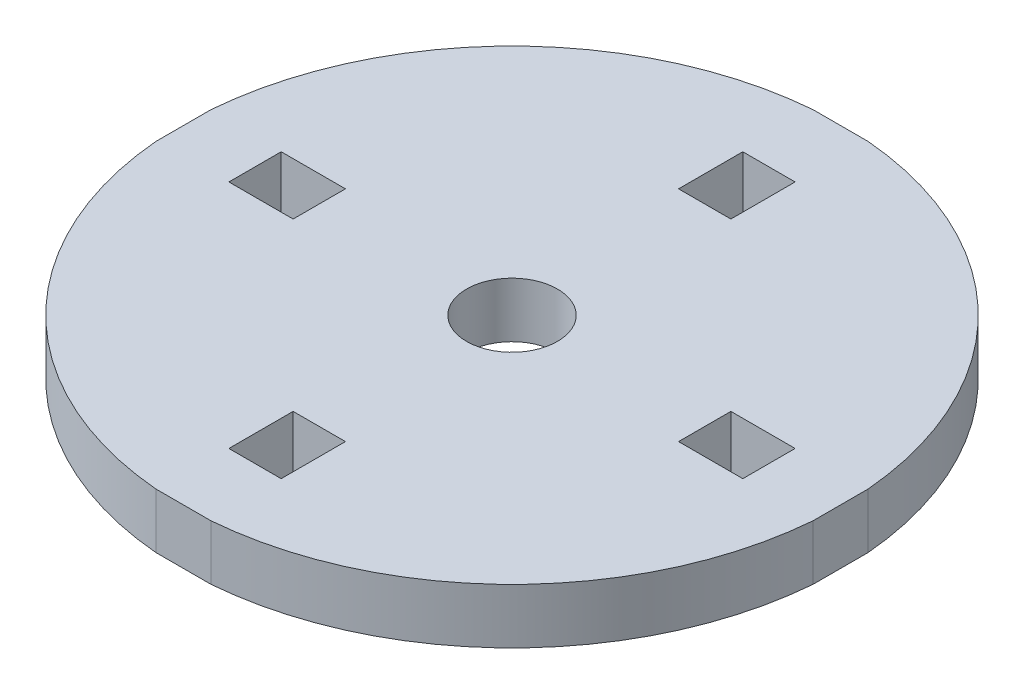
ISO-10303-21;
HEADER;
FILE_DESCRIPTION(('STEP AP214'),'2;1');
FILE_NAME('part.step','',(''),(''),'','','');
FILE_SCHEMA(('AUTOMOTIVE_DESIGN { 1 0 10303 214 1 1 1 1 }'));
ENDSEC;
DATA;
#1=APPLICATION_CONTEXT('core data for automotive mechanical design processes');
#2=APPLICATION_PROTOCOL_DEFINITION('international standard','automotive_design',2000,#1);
#3=PRODUCT_CONTEXT('',#1,'mechanical');
#4=PRODUCT('Part','Part','',(#3));
#5=PRODUCT_RELATED_PRODUCT_CATEGORY('part','',(#4));
#6=PRODUCT_DEFINITION_FORMATION('','',#4);
#7=PRODUCT_DEFINITION_CONTEXT('part definition',#1,'design');
#8=PRODUCT_DEFINITION('design','',#6,#7);
#9=PRODUCT_DEFINITION_SHAPE('','',#8);
#10=(LENGTH_UNIT() NAMED_UNIT(*) SI_UNIT(.MILLI.,.METRE.));
#11=(NAMED_UNIT(*) PLANE_ANGLE_UNIT() SI_UNIT($,.RADIAN.));
#12=(NAMED_UNIT(*) SI_UNIT($,.STERADIAN.) SOLID_ANGLE_UNIT());
#13=UNCERTAINTY_MEASURE_WITH_UNIT(LENGTH_MEASURE(1.E-05),#10,'distance_accuracy_value','');
#14=(GEOMETRIC_REPRESENTATION_CONTEXT(3) GLOBAL_UNCERTAINTY_ASSIGNED_CONTEXT((#13)) GLOBAL_UNIT_ASSIGNED_CONTEXT((#10,
#11,#12)) REPRESENTATION_CONTEXT('',''));
#15=CARTESIAN_POINT('',(0.,0.,0.));
#16=DIRECTION('',(0.,0.,1.));
#17=DIRECTION('',(1.,0.,0.));
#18=AXIS2_PLACEMENT_3D('',#15,#16,#17);
#19=CARTESIAN_POINT('',(0.,3.,0.));
#20=DIRECTION('',(0.,1.,0.));
#21=DIRECTION('',(0.,0.,1.));
#22=AXIS2_PLACEMENT_3D('',#19,#20,#21);
#23=PLANE('',#22);
#24=CARTESIAN_POINT('',(0.,3.,0.));
#25=DIRECTION('',(0.,1.,0.));
#26=DIRECTION('',(0.,0.,1.));
#27=AXIS2_PLACEMENT_3D('',#24,#25,#26);
#28=CIRCLE('',#27,17.9627392120467);
#29=CARTESIAN_POINT('',(-17.9,3.,1.5));
#30=VERTEX_POINT('',#29);
#31=CARTESIAN_POINT('',(-1.5,3.,17.9));
#32=VERTEX_POINT('',#31);
#33=EDGE_CURVE('E329',#30,#32,#28,.T.);
#34=ORIENTED_EDGE('',*,*,#33,.T.);
#35=DIRECTION('',(1.,0.,0.));
#36=VECTOR('',#35,1.);
#37=CARTESIAN_POINT('',(-1.5,3.,17.9));
#38=LINE('',#37,#36);
#39=CARTESIAN_POINT('',(1.5,3.,17.9));
#40=VERTEX_POINT('',#39);
#41=EDGE_CURVE('E332',#32,#40,#38,.T.);
#42=ORIENTED_EDGE('',*,*,#41,.T.);
#43=CARTESIAN_POINT('',(0.,3.,0.));
#44=DIRECTION('',(0.,1.,0.));
#45=DIRECTION('',(0.,0.,-1.));
#46=AXIS2_PLACEMENT_3D('',#43,#44,#45);
#47=CIRCLE('',#46,17.9627392120467);
#48=CARTESIAN_POINT('',(17.9,3.,1.5));
#49=VERTEX_POINT('',#48);
#50=EDGE_CURVE('E335',#40,#49,#47,.T.);
#51=ORIENTED_EDGE('',*,*,#50,.T.);
#52=DIRECTION('',(0.,0.,-1.));
#53=VECTOR('',#52,1.);
#54=CARTESIAN_POINT('',(17.9,3.,1.5));
#55=LINE('',#54,#53);
#56=CARTESIAN_POINT('',(17.9,3.,-1.5));
#57=VERTEX_POINT('',#56);
#58=EDGE_CURVE('E337',#49,#57,#55,.T.);
#59=ORIENTED_EDGE('',*,*,#58,.T.);
#60=CARTESIAN_POINT('',(0.,3.,0.));
#61=DIRECTION('',(0.,1.,0.));
#62=DIRECTION('',(0.,0.,-1.));
#63=AXIS2_PLACEMENT_3D('',#60,#61,#62);
#64=CIRCLE('',#63,17.9627392120467);
#65=CARTESIAN_POINT('',(1.5,3.,-17.9));
#66=VERTEX_POINT('',#65);
#67=EDGE_CURVE('E339',#57,#66,#64,.T.);
#68=ORIENTED_EDGE('',*,*,#67,.T.);
#69=DIRECTION('',(-1.,0.,0.));
#70=VECTOR('',#69,1.);
#71=CARTESIAN_POINT('',(1.5,3.,-17.9));
#72=LINE('',#71,#70);
#73=CARTESIAN_POINT('',(-1.5,3.,-17.9));
#74=VERTEX_POINT('',#73);
#75=EDGE_CURVE('E341',#66,#74,#72,.T.);
#76=ORIENTED_EDGE('',*,*,#75,.T.);
#77=CARTESIAN_POINT('',(0.,3.,0.));
#78=DIRECTION('',(0.,1.,0.));
#79=DIRECTION('',(0.,0.,-1.));
#80=AXIS2_PLACEMENT_3D('',#77,#78,#79);
#81=CIRCLE('',#80,17.9627392120467);
#82=CARTESIAN_POINT('',(-17.9,3.,-1.49999999999999));
#83=VERTEX_POINT('',#82);
#84=EDGE_CURVE('E343',#74,#83,#81,.T.);
#85=ORIENTED_EDGE('',*,*,#84,.T.);
#86=DIRECTION('',(0.,0.,1.));
#87=VECTOR('',#86,1.);
#88=CARTESIAN_POINT('',(-17.9,3.,-1.5));
#89=LINE('',#88,#87);
#90=EDGE_CURVE('E345',#83,#30,#89,.T.);
#91=ORIENTED_EDGE('',*,*,#90,.T.);
#92=EDGE_LOOP('',(#34,#42,#51,#59,#68,#76,#85,#91));
#93=FACE_BOUND('',#92,.T.);
#94=CARTESIAN_POINT('',(0.,3.,0.));
#95=DIRECTION('',(0.,1.,0.));
#96=DIRECTION('',(0.,0.,1.));
#97=AXIS2_PLACEMENT_3D('',#94,#95,#96);
#98=CIRCLE('',#97,2.475);
#99=CARTESIAN_POINT('',(0.,3.,2.475));
#100=VERTEX_POINT('',#99);
#101=EDGE_CURVE('E323',#100,#100,#98,.T.);
#102=ORIENTED_EDGE('',*,*,#101,.F.);
#103=EDGE_LOOP('',(#102));
#104=FACE_BOUND('',#103,.T.);
#105=DIRECTION('',(1.,0.,0.));
#106=VECTOR('',#105,1.);
#107=CARTESIAN_POINT('',(1.425,3.,14.));
#108=LINE('',#107,#106);
#109=CARTESIAN_POINT('',(-1.425,3.,14.));
#110=VERTEX_POINT('',#109);
#111=CARTESIAN_POINT('',(1.425,3.,14.));
#112=VERTEX_POINT('',#111);
#113=EDGE_CURVE('E294',#110,#112,#108,.T.);
#114=ORIENTED_EDGE('',*,*,#113,.F.);
#115=DIRECTION('',(0.,0.,1.));
#116=VECTOR('',#115,1.);
#117=CARTESIAN_POINT('',(-1.425,3.,14.));
#118=LINE('',#117,#116);
#119=CARTESIAN_POINT('',(-1.425,3.,10.5));
#120=VERTEX_POINT('',#119);
#121=EDGE_CURVE('E292',#120,#110,#118,.T.);
#122=ORIENTED_EDGE('',*,*,#121,.F.);
#123=DIRECTION('',(-1.,0.,0.));
#124=VECTOR('',#123,1.);
#125=CARTESIAN_POINT('',(1.425,3.,10.5));
#126=LINE('',#125,#124);
#127=CARTESIAN_POINT('',(1.425,3.,10.5));
#128=VERTEX_POINT('',#127);
#129=EDGE_CURVE('E300',#128,#120,#126,.T.);
#130=ORIENTED_EDGE('',*,*,#129,.F.);
#131=DIRECTION('',(0.,0.,-1.));
#132=VECTOR('',#131,1.);
#133=CARTESIAN_POINT('',(1.425,3.,14.));
#134=LINE('',#133,#132);
#135=EDGE_CURVE('E297',#112,#128,#134,.T.);
#136=ORIENTED_EDGE('',*,*,#135,.F.);
#137=EDGE_LOOP('',(#114,#122,#130,#136));
#138=FACE_BOUND('',#137,.T.);
#139=DIRECTION('',(0.,0.,1.));
#140=VECTOR('',#139,1.);
#141=CARTESIAN_POINT('',(-14.,3.,1.425));
#142=LINE('',#141,#140);
#143=CARTESIAN_POINT('',(-14.,3.,-1.425));
#144=VERTEX_POINT('',#143);
#145=CARTESIAN_POINT('',(-14.,3.,1.425));
#146=VERTEX_POINT('',#145);
#147=EDGE_CURVE('E263',#144,#146,#142,.T.);
#148=ORIENTED_EDGE('',*,*,#147,.F.);
#149=DIRECTION('',(-1.,0.,0.));
#150=VECTOR('',#149,1.);
#151=CARTESIAN_POINT('',(-14.,3.,-1.425));
#152=LINE('',#151,#150);
#153=CARTESIAN_POINT('',(-10.5,3.,-1.425));
#154=VERTEX_POINT('',#153);
#155=EDGE_CURVE('E261',#154,#144,#152,.T.);
#156=ORIENTED_EDGE('',*,*,#155,.F.);
#157=DIRECTION('',(0.,0.,-1.));
#158=VECTOR('',#157,1.);
#159=CARTESIAN_POINT('',(-10.5,3.,1.425));
#160=LINE('',#159,#158);
#161=CARTESIAN_POINT('',(-10.5,3.,1.425));
#162=VERTEX_POINT('',#161);
#163=EDGE_CURVE('E269',#162,#154,#160,.T.);
#164=ORIENTED_EDGE('',*,*,#163,.F.);
#165=DIRECTION('',(1.,0.,0.));
#166=VECTOR('',#165,1.);
#167=CARTESIAN_POINT('',(-14.,3.,1.425));
#168=LINE('',#167,#166);
#169=EDGE_CURVE('E266',#146,#162,#168,.T.);
#170=ORIENTED_EDGE('',*,*,#169,.F.);
#171=EDGE_LOOP('',(#148,#156,#164,#170));
#172=FACE_BOUND('',#171,.T.);
#173=DIRECTION('',(-1.,0.,0.));
#174=VECTOR('',#173,1.);
#175=CARTESIAN_POINT('',(-1.425,3.,-14.));
#176=LINE('',#175,#174);
#177=CARTESIAN_POINT('',(1.425,3.,-14.));
#178=VERTEX_POINT('',#177);
#179=CARTESIAN_POINT('',(-1.425,3.,-14.));
#180=VERTEX_POINT('',#179);
#181=EDGE_CURVE('E232',#178,#180,#176,.T.);
#182=ORIENTED_EDGE('',*,*,#181,.F.);
#183=DIRECTION('',(0.,0.,-1.));
#184=VECTOR('',#183,1.);
#185=CARTESIAN_POINT('',(1.425,3.,-14.));
#186=LINE('',#185,#184);
#187=CARTESIAN_POINT('',(1.425,3.,-10.5));
#188=VERTEX_POINT('',#187);
#189=EDGE_CURVE('E230',#188,#178,#186,.T.);
#190=ORIENTED_EDGE('',*,*,#189,.F.);
#191=DIRECTION('',(1.,0.,0.));
#192=VECTOR('',#191,1.);
#193=CARTESIAN_POINT('',(-1.425,3.,-10.5));
#194=LINE('',#193,#192);
#195=CARTESIAN_POINT('',(-1.425,3.,-10.5));
#196=VERTEX_POINT('',#195);
#197=EDGE_CURVE('E238',#196,#188,#194,.T.);
#198=ORIENTED_EDGE('',*,*,#197,.F.);
#199=DIRECTION('',(0.,0.,1.));
#200=VECTOR('',#199,1.);
#201=CARTESIAN_POINT('',(-1.425,3.,-14.));
#202=LINE('',#201,#200);
#203=EDGE_CURVE('E235',#180,#196,#202,.T.);
#204=ORIENTED_EDGE('',*,*,#203,.F.);
#205=EDGE_LOOP('',(#182,#190,#198,#204));
#206=FACE_BOUND('',#205,.T.);
#207=DIRECTION('',(0.,0.,-1.));
#208=VECTOR('',#207,1.);
#209=CARTESIAN_POINT('',(14.,3.,-1.425));
#210=LINE('',#209,#208);
#211=CARTESIAN_POINT('',(14.,3.,1.425));
#212=VERTEX_POINT('',#211);
#213=CARTESIAN_POINT('',(14.,3.,-1.425));
#214=VERTEX_POINT('',#213);
#215=EDGE_CURVE('E202',#212,#214,#210,.T.);
#216=ORIENTED_EDGE('',*,*,#215,.F.);
#217=DIRECTION('',(1.,0.,0.));
#218=VECTOR('',#217,1.);
#219=CARTESIAN_POINT('',(14.,3.,1.425));
#220=LINE('',#219,#218);
#221=CARTESIAN_POINT('',(10.5,3.,1.425));
#222=VERTEX_POINT('',#221);
#223=EDGE_CURVE('E194',#222,#212,#220,.T.);
#224=ORIENTED_EDGE('',*,*,#223,.F.);
#225=DIRECTION('',(0.,0.,1.));
#226=VECTOR('',#225,1.);
#227=CARTESIAN_POINT('',(10.5,3.,-1.425));
#228=LINE('',#227,#226);
#229=CARTESIAN_POINT('',(10.5,3.,-1.425));
#230=VERTEX_POINT('',#229);
#231=EDGE_CURVE('E216',#230,#222,#228,.T.);
#232=ORIENTED_EDGE('',*,*,#231,.F.);
#233=DIRECTION('',(-1.,0.,0.));
#234=VECTOR('',#233,1.);
#235=CARTESIAN_POINT('',(14.,3.,-1.425));
#236=LINE('',#235,#234);
#237=EDGE_CURVE('E214',#214,#230,#236,.T.);
#238=ORIENTED_EDGE('',*,*,#237,.F.);
#239=EDGE_LOOP('',(#216,#224,#232,#238));
#240=FACE_BOUND('',#239,.T.);
#241=ADVANCED_FACE('F33',(#93,#104,#138,#172,#206,#240),#23,.T.);
#242=CARTESIAN_POINT('',(0.,0.,0.));
#243=DIRECTION('',(0.,1.,0.));
#244=DIRECTION('',(0.,0.,1.));
#245=AXIS2_PLACEMENT_3D('',#242,#243,#244);
#246=PLANE('',#245);
#247=DIRECTION('',(0.,0.,-1.));
#248=VECTOR('',#247,1.);
#249=CARTESIAN_POINT('',(1.425,0.,-14.));
#250=LINE('',#249,#248);
#251=CARTESIAN_POINT('',(1.425,0.,-10.5));
#252=VERTEX_POINT('',#251);
#253=CARTESIAN_POINT('',(1.425,0.,-14.));
#254=VERTEX_POINT('',#253);
#255=EDGE_CURVE('E210',#252,#254,#250,.T.);
#256=ORIENTED_EDGE('',*,*,#255,.T.);
#257=DIRECTION('',(-1.,0.,0.));
#258=VECTOR('',#257,1.);
#259=CARTESIAN_POINT('',(-1.425,0.,-14.));
#260=LINE('',#259,#258);
#261=CARTESIAN_POINT('',(-1.425,0.,-14.));
#262=VERTEX_POINT('',#261);
#263=EDGE_CURVE('E243',#254,#262,#260,.T.);
#264=ORIENTED_EDGE('',*,*,#263,.T.);
#265=DIRECTION('',(0.,0.,1.));
#266=VECTOR('',#265,1.);
#267=CARTESIAN_POINT('',(-1.425,0.,-14.));
#268=LINE('',#267,#266);
#269=CARTESIAN_POINT('',(-1.425,0.,-10.5));
#270=VERTEX_POINT('',#269);
#271=EDGE_CURVE('E246',#262,#270,#268,.T.);
#272=ORIENTED_EDGE('',*,*,#271,.T.);
#273=DIRECTION('',(1.,0.,0.));
#274=VECTOR('',#273,1.);
#275=CARTESIAN_POINT('',(-1.425,0.,-10.5));
#276=LINE('',#275,#274);
#277=EDGE_CURVE('E233',#270,#252,#276,.T.);
#278=ORIENTED_EDGE('',*,*,#277,.T.);
#279=EDGE_LOOP('',(#256,#264,#272,#278));
#280=FACE_BOUND('',#279,.T.);
#281=DIRECTION('',(0.,0.,1.));
#282=VECTOR('',#281,1.);
#283=CARTESIAN_POINT('',(-1.425,0.,14.));
#284=LINE('',#283,#282);
#285=CARTESIAN_POINT('',(-1.425,0.,10.5));
#286=VERTEX_POINT('',#285);
#287=CARTESIAN_POINT('',(-1.425,0.,14.));
#288=VERTEX_POINT('',#287);
#289=EDGE_CURVE('E291',#286,#288,#284,.T.);
#290=ORIENTED_EDGE('',*,*,#289,.T.);
#291=DIRECTION('',(1.,0.,0.));
#292=VECTOR('',#291,1.);
#293=CARTESIAN_POINT('',(1.425,0.,14.));
#294=LINE('',#293,#292);
#295=CARTESIAN_POINT('',(1.425,0.,14.));
#296=VERTEX_POINT('',#295);
#297=EDGE_CURVE('E305',#288,#296,#294,.T.);
#298=ORIENTED_EDGE('',*,*,#297,.T.);
#299=DIRECTION('',(0.,0.,-1.));
#300=VECTOR('',#299,1.);
#301=CARTESIAN_POINT('',(1.425,0.,14.));
#302=LINE('',#301,#300);
#303=CARTESIAN_POINT('',(1.425,0.,10.5));
#304=VERTEX_POINT('',#303);
#305=EDGE_CURVE('E308',#296,#304,#302,.T.);
#306=ORIENTED_EDGE('',*,*,#305,.T.);
#307=DIRECTION('',(-1.,0.,0.));
#308=VECTOR('',#307,1.);
#309=CARTESIAN_POINT('',(1.425,0.,10.5));
#310=LINE('',#309,#308);
#311=EDGE_CURVE('E295',#304,#286,#310,.T.);
#312=ORIENTED_EDGE('',*,*,#311,.T.);
#313=EDGE_LOOP('',(#290,#298,#306,#312));
#314=FACE_BOUND('',#313,.T.);
#315=CARTESIAN_POINT('',(0.,0.,0.));
#316=DIRECTION('',(0.,1.,0.));
#317=DIRECTION('',(0.,0.,1.));
#318=AXIS2_PLACEMENT_3D('',#315,#316,#317);
#319=CIRCLE('',#318,17.9627392120467);
#320=CARTESIAN_POINT('',(-17.9,0.,1.5));
#321=VERTEX_POINT('',#320);
#322=CARTESIAN_POINT('',(-1.5,0.,17.9));
#323=VERTEX_POINT('',#322);
#324=EDGE_CURVE('E326',#321,#323,#319,.T.);
#325=ORIENTED_EDGE('',*,*,#324,.F.);
#326=DIRECTION('',(0.,0.,1.));
#327=VECTOR('',#326,1.);
#328=CARTESIAN_POINT('',(-17.9,0.,-1.5));
#329=LINE('',#328,#327);
#330=CARTESIAN_POINT('',(-17.9,0.,-1.49999999999999));
#331=VERTEX_POINT('',#330);
#332=EDGE_CURVE('E333',#331,#321,#329,.T.);
#333=ORIENTED_EDGE('',*,*,#332,.F.);
#334=CARTESIAN_POINT('',(0.,0.,0.));
#335=DIRECTION('',(0.,1.,0.));
#336=DIRECTION('',(0.,0.,-1.));
#337=AXIS2_PLACEMENT_3D('',#334,#335,#336);
#338=CIRCLE('',#337,17.9627392120467);
#339=CARTESIAN_POINT('',(-1.5,0.,-17.9));
#340=VERTEX_POINT('',#339);
#341=EDGE_CURVE('E360',#340,#331,#338,.T.);
#342=ORIENTED_EDGE('',*,*,#341,.F.);
#343=DIRECTION('',(-1.,0.,0.));
#344=VECTOR('',#343,1.);
#345=CARTESIAN_POINT('',(1.5,0.,-17.9));
#346=LINE('',#345,#344);
#347=CARTESIAN_POINT('',(1.5,0.,-17.9));
#348=VERTEX_POINT('',#347);
#349=EDGE_CURVE('E358',#348,#340,#346,.T.);
#350=ORIENTED_EDGE('',*,*,#349,.F.);
#351=CARTESIAN_POINT('',(0.,0.,0.));
#352=DIRECTION('',(0.,1.,0.));
#353=DIRECTION('',(0.,0.,-1.));
#354=AXIS2_PLACEMENT_3D('',#351,#352,#353);
#355=CIRCLE('',#354,17.9627392120467);
#356=CARTESIAN_POINT('',(17.9,0.,-1.5));
#357=VERTEX_POINT('',#356);
#358=EDGE_CURVE('E356',#357,#348,#355,.T.);
#359=ORIENTED_EDGE('',*,*,#358,.F.);
#360=DIRECTION('',(0.,0.,-1.));
#361=VECTOR('',#360,1.);
#362=CARTESIAN_POINT('',(17.9,0.,1.5));
#363=LINE('',#362,#361);
#364=CARTESIAN_POINT('',(17.9,0.,1.5));
#365=VERTEX_POINT('',#364);
#366=EDGE_CURVE('E354',#365,#357,#363,.T.);
#367=ORIENTED_EDGE('',*,*,#366,.F.);
#368=CARTESIAN_POINT('',(0.,0.,0.));
#369=DIRECTION('',(0.,1.,0.));
#370=DIRECTION('',(0.,0.,-1.));
#371=AXIS2_PLACEMENT_3D('',#368,#369,#370);
#372=CIRCLE('',#371,17.9627392120467);
#373=CARTESIAN_POINT('',(1.5,0.,17.9));
#374=VERTEX_POINT('',#373);
#375=EDGE_CURVE('E352',#374,#365,#372,.T.);
#376=ORIENTED_EDGE('',*,*,#375,.F.);
#377=DIRECTION('',(1.,0.,0.));
#378=VECTOR('',#377,1.);
#379=CARTESIAN_POINT('',(-1.5,0.,17.9));
#380=LINE('',#379,#378);
#381=EDGE_CURVE('E350',#323,#374,#380,.T.);
#382=ORIENTED_EDGE('',*,*,#381,.F.);
#383=EDGE_LOOP('',(#325,#333,#342,#350,#359,#367,#376,#382));
#384=FACE_BOUND('',#383,.T.);
#385=CARTESIAN_POINT('',(0.,0.,0.));
#386=DIRECTION('',(0.,1.,0.));
#387=DIRECTION('',(0.,0.,1.));
#388=AXIS2_PLACEMENT_3D('',#385,#386,#387);
#389=CIRCLE('',#388,2.475);
#390=CARTESIAN_POINT('',(0.,0.,2.475));
#391=VERTEX_POINT('',#390);
#392=EDGE_CURVE('E322',#391,#391,#389,.T.);
#393=ORIENTED_EDGE('',*,*,#392,.T.);
#394=EDGE_LOOP('',(#393));
#395=FACE_BOUND('',#394,.T.);
#396=DIRECTION('',(-1.,0.,0.));
#397=VECTOR('',#396,1.);
#398=CARTESIAN_POINT('',(-14.,0.,-1.425));
#399=LINE('',#398,#397);
#400=CARTESIAN_POINT('',(-10.5,0.,-1.425));
#401=VERTEX_POINT('',#400);
#402=CARTESIAN_POINT('',(-14.,0.,-1.425));
#403=VERTEX_POINT('',#402);
#404=EDGE_CURVE('E260',#401,#403,#399,.T.);
#405=ORIENTED_EDGE('',*,*,#404,.T.);
#406=DIRECTION('',(0.,0.,1.));
#407=VECTOR('',#406,1.);
#408=CARTESIAN_POINT('',(-14.,0.,1.425));
#409=LINE('',#408,#407);
#410=CARTESIAN_POINT('',(-14.,0.,1.425));
#411=VERTEX_POINT('',#410);
#412=EDGE_CURVE('E274',#403,#411,#409,.T.);
#413=ORIENTED_EDGE('',*,*,#412,.T.);
#414=DIRECTION('',(1.,0.,0.));
#415=VECTOR('',#414,1.);
#416=CARTESIAN_POINT('',(-14.,0.,1.425));
#417=LINE('',#416,#415);
#418=CARTESIAN_POINT('',(-10.5,0.,1.425));
#419=VERTEX_POINT('',#418);
#420=EDGE_CURVE('E277',#411,#419,#417,.T.);
#421=ORIENTED_EDGE('',*,*,#420,.T.);
#422=DIRECTION('',(0.,0.,-1.));
#423=VECTOR('',#422,1.);
#424=CARTESIAN_POINT('',(-10.5,0.,1.425));
#425=LINE('',#424,#423);
#426=EDGE_CURVE('E264',#419,#401,#425,.T.);
#427=ORIENTED_EDGE('',*,*,#426,.T.);
#428=EDGE_LOOP('',(#405,#413,#421,#427));
#429=FACE_BOUND('',#428,.T.);
#430=DIRECTION('',(1.,0.,0.));
#431=VECTOR('',#430,1.);
#432=CARTESIAN_POINT('',(14.,0.,1.425));
#433=LINE('',#432,#431);
#434=CARTESIAN_POINT('',(10.5,0.,1.425));
#435=VERTEX_POINT('',#434);
#436=CARTESIAN_POINT('',(14.,0.,1.425));
#437=VERTEX_POINT('',#436);
#438=EDGE_CURVE('E56',#435,#437,#433,.T.);
#439=ORIENTED_EDGE('',*,*,#438,.T.);
#440=DIRECTION('',(0.,0.,-1.));
#441=VECTOR('',#440,1.);
#442=CARTESIAN_POINT('',(14.,0.,-1.425));
#443=LINE('',#442,#441);
#444=CARTESIAN_POINT('',(14.,0.,-1.425));
#445=VERTEX_POINT('',#444);
#446=EDGE_CURVE('E209',#437,#445,#443,.T.);
#447=ORIENTED_EDGE('',*,*,#446,.T.);
#448=DIRECTION('',(-1.,0.,0.));
#449=VECTOR('',#448,1.);
#450=CARTESIAN_POINT('',(14.,0.,-1.425));
#451=LINE('',#450,#449);
#452=CARTESIAN_POINT('',(10.5,0.,-1.425));
#453=VERTEX_POINT('',#452);
#454=EDGE_CURVE('E222',#445,#453,#451,.T.);
#455=ORIENTED_EDGE('',*,*,#454,.T.);
#456=DIRECTION('',(0.,0.,1.));
#457=VECTOR('',#456,1.);
#458=CARTESIAN_POINT('',(10.5,0.,-1.425));
#459=LINE('',#458,#457);
#460=EDGE_CURVE('E203',#453,#435,#459,.T.);
#461=ORIENTED_EDGE('',*,*,#460,.T.);
#462=EDGE_LOOP('',(#439,#447,#455,#461));
#463=FACE_BOUND('',#462,.T.);
#464=ADVANCED_FACE('F390',(#280,#314,#384,#395,#429,#463),#246,.F.);
#465=CARTESIAN_POINT('',(0.,3.,0.));
#466=DIRECTION('',(0.,-1.,0.));
#467=DIRECTION('',(0.,0.,-1.));
#468=AXIS2_PLACEMENT_3D('',#465,#466,#467);
#469=CYLINDRICAL_SURFACE('',#468,17.9627392120467);
#470=ORIENTED_EDGE('',*,*,#324,.T.);
#471=DIRECTION('',(0.,-1.,0.));
#472=VECTOR('',#471,1.);
#473=CARTESIAN_POINT('',(-1.5,3.,17.9));
#474=LINE('',#473,#472);
#475=EDGE_CURVE('E11',#32,#323,#474,.T.);
#476=ORIENTED_EDGE('',*,*,#475,.F.);
#477=ORIENTED_EDGE('',*,*,#33,.F.);
#478=DIRECTION('',(0.,-1.,0.));
#479=VECTOR('',#478,1.);
#480=CARTESIAN_POINT('',(-17.9,3.,1.5));
#481=LINE('',#480,#479);
#482=EDGE_CURVE('E347',#30,#321,#481,.T.);
#483=ORIENTED_EDGE('',*,*,#482,.T.);
#484=EDGE_LOOP('',(#470,#476,#477,#483));
#485=FACE_BOUND('',#484,.T.);
#486=ADVANCED_FACE('F35',(#485),#469,.T.);
#487=CARTESIAN_POINT('',(-1.5,3.,17.9));
#488=DIRECTION('',(0.,0.,-1.));
#489=DIRECTION('',(-1.,0.,0.));
#490=AXIS2_PLACEMENT_3D('',#487,#488,#489);
#491=PLANE('',#490);
#492=ORIENTED_EDGE('',*,*,#381,.T.);
#493=DIRECTION('',(0.,-1.,0.));
#494=VECTOR('',#493,1.);
#495=CARTESIAN_POINT('',(1.5,3.,17.9));
#496=LINE('',#495,#494);
#497=EDGE_CURVE('E41',#40,#374,#496,.T.);
#498=ORIENTED_EDGE('',*,*,#497,.F.);
#499=ORIENTED_EDGE('',*,*,#41,.F.);
#500=ORIENTED_EDGE('',*,*,#475,.T.);
#501=EDGE_LOOP('',(#492,#498,#499,#500));
#502=FACE_BOUND('',#501,.T.);
#503=ADVANCED_FACE('F408',(#502),#491,.F.);
#504=CARTESIAN_POINT('',(0.,3.,0.));
#505=DIRECTION('',(0.,-1.,0.));
#506=DIRECTION('',(0.,0.,-1.));
#507=AXIS2_PLACEMENT_3D('',#504,#505,#506);
#508=CYLINDRICAL_SURFACE('',#507,17.9627392120467);
#509=ORIENTED_EDGE('',*,*,#375,.T.);
#510=DIRECTION('',(0.,-1.,0.));
#511=VECTOR('',#510,1.);
#512=CARTESIAN_POINT('',(17.9,3.,1.5));
#513=LINE('',#512,#511);
#514=EDGE_CURVE('E377',#49,#365,#513,.T.);
#515=ORIENTED_EDGE('',*,*,#514,.F.);
#516=ORIENTED_EDGE('',*,*,#50,.F.);
#517=ORIENTED_EDGE('',*,*,#497,.T.);
#518=EDGE_LOOP('',(#509,#515,#516,#517));
#519=FACE_BOUND('',#518,.T.);
#520=ADVANCED_FACE('F384',(#519),#508,.T.);
#521=CARTESIAN_POINT('',(17.9,3.,1.5));
#522=DIRECTION('',(-1.,0.,0.));
#523=DIRECTION('',(0.,0.,1.));
#524=AXIS2_PLACEMENT_3D('',#521,#522,#523);
#525=PLANE('',#524);
#526=ORIENTED_EDGE('',*,*,#366,.T.);
#527=DIRECTION('',(0.,-1.,0.));
#528=VECTOR('',#527,1.);
#529=CARTESIAN_POINT('',(17.9,3.,-1.5));
#530=LINE('',#529,#528);
#531=EDGE_CURVE('E374',#57,#357,#530,.T.);
#532=ORIENTED_EDGE('',*,*,#531,.F.);
#533=ORIENTED_EDGE('',*,*,#58,.F.);
#534=ORIENTED_EDGE('',*,*,#514,.T.);
#535=EDGE_LOOP('',(#526,#532,#533,#534));
#536=FACE_BOUND('',#535,.T.);
#537=ADVANCED_FACE('F396',(#536),#525,.F.);
#538=CARTESIAN_POINT('',(0.,3.,0.));
#539=DIRECTION('',(0.,-1.,0.));
#540=DIRECTION('',(0.,0.,-1.));
#541=AXIS2_PLACEMENT_3D('',#538,#539,#540);
#542=CYLINDRICAL_SURFACE('',#541,17.9627392120467);
#543=ORIENTED_EDGE('',*,*,#358,.T.);
#544=DIRECTION('',(0.,-1.,0.));
#545=VECTOR('',#544,1.);
#546=CARTESIAN_POINT('',(1.5,3.,-17.9));
#547=LINE('',#546,#545);
#548=EDGE_CURVE('E371',#66,#348,#547,.T.);
#549=ORIENTED_EDGE('',*,*,#548,.F.);
#550=ORIENTED_EDGE('',*,*,#67,.F.);
#551=ORIENTED_EDGE('',*,*,#531,.T.);
#552=EDGE_LOOP('',(#543,#549,#550,#551));
#553=FACE_BOUND('',#552,.T.);
#554=ADVANCED_FACE('F400',(#553),#542,.T.);
#555=CARTESIAN_POINT('',(1.5,3.,-17.9));
#556=DIRECTION('',(0.,0.,1.));
#557=DIRECTION('',(1.,0.,0.));
#558=AXIS2_PLACEMENT_3D('',#555,#556,#557);
#559=PLANE('',#558);
#560=ORIENTED_EDGE('',*,*,#349,.T.);
#561=DIRECTION('',(0.,-1.,0.));
#562=VECTOR('',#561,1.);
#563=CARTESIAN_POINT('',(-1.5,3.,-17.9));
#564=LINE('',#563,#562);
#565=EDGE_CURVE('E368',#74,#340,#564,.T.);
#566=ORIENTED_EDGE('',*,*,#565,.F.);
#567=ORIENTED_EDGE('',*,*,#75,.F.);
#568=ORIENTED_EDGE('',*,*,#548,.T.);
#569=EDGE_LOOP('',(#560,#566,#567,#568));
#570=FACE_BOUND('',#569,.T.);
#571=ADVANCED_FACE('F421',(#570),#559,.F.);
#572=CARTESIAN_POINT('',(0.,3.,0.));
#573=DIRECTION('',(0.,-1.,0.));
#574=DIRECTION('',(0.,0.,-1.));
#575=AXIS2_PLACEMENT_3D('',#572,#573,#574);
#576=CYLINDRICAL_SURFACE('',#575,17.9627392120467);
#577=ORIENTED_EDGE('',*,*,#341,.T.);
#578=DIRECTION('',(0.,-1.,0.));
#579=VECTOR('',#578,1.);
#580=CARTESIAN_POINT('',(-17.9,3.,-1.49999999999999));
#581=LINE('',#580,#579);
#582=EDGE_CURVE('E365',#83,#331,#581,.T.);
#583=ORIENTED_EDGE('',*,*,#582,.F.);
#584=ORIENTED_EDGE('',*,*,#84,.F.);
#585=ORIENTED_EDGE('',*,*,#565,.T.);
#586=EDGE_LOOP('',(#577,#583,#584,#585));
#587=FACE_BOUND('',#586,.T.);
#588=ADVANCED_FACE('F419',(#587),#576,.T.);
#589=CARTESIAN_POINT('',(-17.9,3.,-1.5));
#590=DIRECTION('',(1.,0.,0.));
#591=DIRECTION('',(0.,0.,-1.));
#592=AXIS2_PLACEMENT_3D('',#589,#590,#591);
#593=PLANE('',#592);
#594=ORIENTED_EDGE('',*,*,#332,.T.);
#595=ORIENTED_EDGE('',*,*,#482,.F.);
#596=ORIENTED_EDGE('',*,*,#90,.F.);
#597=ORIENTED_EDGE('',*,*,#582,.T.);
#598=EDGE_LOOP('',(#594,#595,#596,#597));
#599=FACE_BOUND('',#598,.T.);
#600=ADVANCED_FACE('F414',(#599),#593,.F.);
#601=CARTESIAN_POINT('',(0.,3.,0.));
#602=DIRECTION('',(0.,-1.,0.));
#603=DIRECTION('',(0.,0.,-1.));
#604=AXIS2_PLACEMENT_3D('',#601,#602,#603);
#605=CYLINDRICAL_SURFACE('',#604,2.475);
#606=ORIENTED_EDGE('',*,*,#101,.T.);
#607=EDGE_LOOP('',(#606));
#608=FACE_BOUND('',#607,.T.);
#609=ORIENTED_EDGE('',*,*,#392,.F.);
#610=EDGE_LOOP('',(#609));
#611=FACE_BOUND('',#610,.T.);
#612=ADVANCED_FACE('F438',(#608,#611),#605,.F.);
#613=CARTESIAN_POINT('',(-1.425,3.,14.));
#614=DIRECTION('',(1.,0.,0.));
#615=DIRECTION('',(0.,0.,-1.));
#616=AXIS2_PLACEMENT_3D('',#613,#614,#615);
#617=PLANE('',#616);
#618=ORIENTED_EDGE('',*,*,#289,.F.);
#619=DIRECTION('',(0.,-1.,0.));
#620=VECTOR('',#619,1.);
#621=CARTESIAN_POINT('',(-1.425,3.,10.5));
#622=LINE('',#621,#620);
#623=EDGE_CURVE('E302',#120,#286,#622,.T.);
#624=ORIENTED_EDGE('',*,*,#623,.F.);
#625=ORIENTED_EDGE('',*,*,#121,.T.);
#626=DIRECTION('',(0.,-1.,0.));
#627=VECTOR('',#626,1.);
#628=CARTESIAN_POINT('',(-1.425,3.,14.));
#629=LINE('',#628,#627);
#630=EDGE_CURVE('E319',#110,#288,#629,.T.);
#631=ORIENTED_EDGE('',*,*,#630,.T.);
#632=EDGE_LOOP('',(#618,#624,#625,#631));
#633=FACE_BOUND('',#632,.T.);
#634=ADVANCED_FACE('F445',(#633),#617,.T.);
#635=CARTESIAN_POINT('',(1.425,3.,14.));
#636=DIRECTION('',(0.,0.,-1.));
#637=DIRECTION('',(-1.,0.,0.));
#638=AXIS2_PLACEMENT_3D('',#635,#636,#637);
#639=PLANE('',#638);
#640=ORIENTED_EDGE('',*,*,#297,.F.);
#641=ORIENTED_EDGE('',*,*,#630,.F.);
#642=ORIENTED_EDGE('',*,*,#113,.T.);
#643=DIRECTION('',(0.,-1.,0.));
#644=VECTOR('',#643,1.);
#645=CARTESIAN_POINT('',(1.425,3.,14.));
#646=LINE('',#645,#644);
#647=EDGE_CURVE('E317',#112,#296,#646,.T.);
#648=ORIENTED_EDGE('',*,*,#647,.T.);
#649=EDGE_LOOP('',(#640,#641,#642,#648));
#650=FACE_BOUND('',#649,.T.);
#651=ADVANCED_FACE('F450',(#650),#639,.T.);
#652=CARTESIAN_POINT('',(1.425,3.,14.));
#653=DIRECTION('',(-1.,0.,0.));
#654=DIRECTION('',(0.,0.,1.));
#655=AXIS2_PLACEMENT_3D('',#652,#653,#654);
#656=PLANE('',#655);
#657=ORIENTED_EDGE('',*,*,#305,.F.);
#658=ORIENTED_EDGE('',*,*,#647,.F.);
#659=ORIENTED_EDGE('',*,*,#135,.T.);
#660=DIRECTION('',(0.,-1.,0.));
#661=VECTOR('',#660,1.);
#662=CARTESIAN_POINT('',(1.425,3.,10.5));
#663=LINE('',#662,#661);
#664=EDGE_CURVE('E315',#128,#304,#663,.T.);
#665=ORIENTED_EDGE('',*,*,#664,.T.);
#666=EDGE_LOOP('',(#657,#658,#659,#665));
#667=FACE_BOUND('',#666,.T.);
#668=ADVANCED_FACE('F507',(#667),#656,.T.);
#669=CARTESIAN_POINT('',(1.425,3.,10.5));
#670=DIRECTION('',(0.,0.,1.));
#671=DIRECTION('',(1.,0.,0.));
#672=AXIS2_PLACEMENT_3D('',#669,#670,#671);
#673=PLANE('',#672);
#674=ORIENTED_EDGE('',*,*,#311,.F.);
#675=ORIENTED_EDGE('',*,*,#664,.F.);
#676=ORIENTED_EDGE('',*,*,#129,.T.);
#677=ORIENTED_EDGE('',*,*,#623,.T.);
#678=EDGE_LOOP('',(#674,#675,#676,#677));
#679=FACE_BOUND('',#678,.T.);
#680=ADVANCED_FACE('F503',(#679),#673,.T.);
#681=CARTESIAN_POINT('',(-14.,3.,-1.425));
#682=DIRECTION('',(0.,0.,1.));
#683=DIRECTION('',(1.,0.,0.));
#684=AXIS2_PLACEMENT_3D('',#681,#682,#683);
#685=PLANE('',#684);
#686=ORIENTED_EDGE('',*,*,#404,.F.);
#687=DIRECTION('',(0.,-1.,0.));
#688=VECTOR('',#687,1.);
#689=CARTESIAN_POINT('',(-10.5,3.,-1.425));
#690=LINE('',#689,#688);
#691=EDGE_CURVE('E271',#154,#401,#690,.T.);
#692=ORIENTED_EDGE('',*,*,#691,.F.);
#693=ORIENTED_EDGE('',*,*,#155,.T.);
#694=DIRECTION('',(0.,-1.,0.));
#695=VECTOR('',#694,1.);
#696=CARTESIAN_POINT('',(-14.,3.,-1.425));
#697=LINE('',#696,#695);
#698=EDGE_CURVE('E288',#144,#403,#697,.T.);
#699=ORIENTED_EDGE('',*,*,#698,.T.);
#700=EDGE_LOOP('',(#686,#692,#693,#699));
#701=FACE_BOUND('',#700,.T.);
#702=ADVANCED_FACE('F499',(#701),#685,.T.);
#703=CARTESIAN_POINT('',(-14.,3.,1.425));
#704=DIRECTION('',(1.,0.,0.));
#705=DIRECTION('',(0.,0.,-1.));
#706=AXIS2_PLACEMENT_3D('',#703,#704,#705);
#707=PLANE('',#706);
#708=ORIENTED_EDGE('',*,*,#412,.F.);
#709=ORIENTED_EDGE('',*,*,#698,.F.);
#710=ORIENTED_EDGE('',*,*,#147,.T.);
#711=DIRECTION('',(0.,-1.,0.));
#712=VECTOR('',#711,1.);
#713=CARTESIAN_POINT('',(-14.,3.,1.425));
#714=LINE('',#713,#712);
#715=EDGE_CURVE('E286',#146,#411,#714,.T.);
#716=ORIENTED_EDGE('',*,*,#715,.T.);
#717=EDGE_LOOP('',(#708,#709,#710,#716));
#718=FACE_BOUND('',#717,.T.);
#719=ADVANCED_FACE('F495',(#718),#707,.T.);
#720=CARTESIAN_POINT('',(-14.,3.,1.425));
#721=DIRECTION('',(0.,0.,-1.));
#722=DIRECTION('',(-1.,0.,0.));
#723=AXIS2_PLACEMENT_3D('',#720,#721,#722);
#724=PLANE('',#723);
#725=ORIENTED_EDGE('',*,*,#420,.F.);
#726=ORIENTED_EDGE('',*,*,#715,.F.);
#727=ORIENTED_EDGE('',*,*,#169,.T.);
#728=DIRECTION('',(0.,-1.,0.));
#729=VECTOR('',#728,1.);
#730=CARTESIAN_POINT('',(-10.5,3.,1.425));
#731=LINE('',#730,#729);
#732=EDGE_CURVE('E284',#162,#419,#731,.T.);
#733=ORIENTED_EDGE('',*,*,#732,.T.);
#734=EDGE_LOOP('',(#725,#726,#727,#733));
#735=FACE_BOUND('',#734,.T.);
#736=ADVANCED_FACE('F491',(#735),#724,.T.);
#737=CARTESIAN_POINT('',(-10.5,3.,1.425));
#738=DIRECTION('',(-1.,0.,0.));
#739=DIRECTION('',(0.,0.,1.));
#740=AXIS2_PLACEMENT_3D('',#737,#738,#739);
#741=PLANE('',#740);
#742=ORIENTED_EDGE('',*,*,#426,.F.);
#743=ORIENTED_EDGE('',*,*,#732,.F.);
#744=ORIENTED_EDGE('',*,*,#163,.T.);
#745=ORIENTED_EDGE('',*,*,#691,.T.);
#746=EDGE_LOOP('',(#742,#743,#744,#745));
#747=FACE_BOUND('',#746,.T.);
#748=ADVANCED_FACE('F487',(#747),#741,.T.);
#749=CARTESIAN_POINT('',(1.425,3.,-14.));
#750=DIRECTION('',(-1.,0.,0.));
#751=DIRECTION('',(0.,0.,1.));
#752=AXIS2_PLACEMENT_3D('',#749,#750,#751);
#753=PLANE('',#752);
#754=ORIENTED_EDGE('',*,*,#255,.F.);
#755=DIRECTION('',(0.,-1.,0.));
#756=VECTOR('',#755,1.);
#757=CARTESIAN_POINT('',(1.425,3.,-10.5));
#758=LINE('',#757,#756);
#759=EDGE_CURVE('E240',#188,#252,#758,.T.);
#760=ORIENTED_EDGE('',*,*,#759,.F.);
#761=ORIENTED_EDGE('',*,*,#189,.T.);
#762=DIRECTION('',(0.,-1.,0.));
#763=VECTOR('',#762,1.);
#764=CARTESIAN_POINT('',(1.425,3.,-14.));
#765=LINE('',#764,#763);
#766=EDGE_CURVE('E257',#178,#254,#765,.T.);
#767=ORIENTED_EDGE('',*,*,#766,.T.);
#768=EDGE_LOOP('',(#754,#760,#761,#767));
#769=FACE_BOUND('',#768,.T.);
#770=ADVANCED_FACE('F483',(#769),#753,.T.);
#771=CARTESIAN_POINT('',(-1.425,3.,-14.));
#772=DIRECTION('',(0.,0.,1.));
#773=DIRECTION('',(1.,0.,0.));
#774=AXIS2_PLACEMENT_3D('',#771,#772,#773);
#775=PLANE('',#774);
#776=ORIENTED_EDGE('',*,*,#263,.F.);
#777=ORIENTED_EDGE('',*,*,#766,.F.);
#778=ORIENTED_EDGE('',*,*,#181,.T.);
#779=DIRECTION('',(0.,-1.,0.));
#780=VECTOR('',#779,1.);
#781=CARTESIAN_POINT('',(-1.425,3.,-14.));
#782=LINE('',#781,#780);
#783=EDGE_CURVE('E255',#180,#262,#782,.T.);
#784=ORIENTED_EDGE('',*,*,#783,.T.);
#785=EDGE_LOOP('',(#776,#777,#778,#784));
#786=FACE_BOUND('',#785,.T.);
#787=ADVANCED_FACE('F479',(#786),#775,.T.);
#788=CARTESIAN_POINT('',(-1.425,3.,-14.));
#789=DIRECTION('',(1.,0.,0.));
#790=DIRECTION('',(0.,0.,-1.));
#791=AXIS2_PLACEMENT_3D('',#788,#789,#790);
#792=PLANE('',#791);
#793=ORIENTED_EDGE('',*,*,#271,.F.);
#794=ORIENTED_EDGE('',*,*,#783,.F.);
#795=ORIENTED_EDGE('',*,*,#203,.T.);
#796=DIRECTION('',(0.,-1.,0.));
#797=VECTOR('',#796,1.);
#798=CARTESIAN_POINT('',(-1.425,3.,-10.5));
#799=LINE('',#798,#797);
#800=EDGE_CURVE('E253',#196,#270,#799,.T.);
#801=ORIENTED_EDGE('',*,*,#800,.T.);
#802=EDGE_LOOP('',(#793,#794,#795,#801));
#803=FACE_BOUND('',#802,.T.);
#804=ADVANCED_FACE('F475',(#803),#792,.T.);
#805=CARTESIAN_POINT('',(-1.425,3.,-10.5));
#806=DIRECTION('',(0.,0.,-1.));
#807=DIRECTION('',(-1.,0.,0.));
#808=AXIS2_PLACEMENT_3D('',#805,#806,#807);
#809=PLANE('',#808);
#810=ORIENTED_EDGE('',*,*,#277,.F.);
#811=ORIENTED_EDGE('',*,*,#800,.F.);
#812=ORIENTED_EDGE('',*,*,#197,.T.);
#813=ORIENTED_EDGE('',*,*,#759,.T.);
#814=EDGE_LOOP('',(#810,#811,#812,#813));
#815=FACE_BOUND('',#814,.T.);
#816=ADVANCED_FACE('F472',(#815),#809,.T.);
#817=CARTESIAN_POINT('',(14.,3.,1.425));
#818=DIRECTION('',(0.,0.,-1.));
#819=DIRECTION('',(-1.,0.,0.));
#820=AXIS2_PLACEMENT_3D('',#817,#818,#819);
#821=PLANE('',#820);
#822=ORIENTED_EDGE('',*,*,#438,.F.);
#823=DIRECTION('',(0.,-1.,0.));
#824=VECTOR('',#823,1.);
#825=CARTESIAN_POINT('',(10.5,3.,1.425));
#826=LINE('',#825,#824);
#827=EDGE_CURVE('E198',#222,#435,#826,.T.);
#828=ORIENTED_EDGE('',*,*,#827,.F.);
#829=ORIENTED_EDGE('',*,*,#223,.T.);
#830=DIRECTION('',(0.,-1.,0.));
#831=VECTOR('',#830,1.);
#832=CARTESIAN_POINT('',(14.,3.,1.425));
#833=LINE('',#832,#831);
#834=EDGE_CURVE('E197',#212,#437,#833,.T.);
#835=ORIENTED_EDGE('',*,*,#834,.T.);
#836=EDGE_LOOP('',(#822,#828,#829,#835));
#837=FACE_BOUND('',#836,.T.);
#838=ADVANCED_FACE('F196',(#837),#821,.T.);
#839=CARTESIAN_POINT('',(14.,3.,-1.425));
#840=DIRECTION('',(-1.,0.,0.));
#841=DIRECTION('',(0.,0.,1.));
#842=AXIS2_PLACEMENT_3D('',#839,#840,#841);
#843=PLANE('',#842);
#844=ORIENTED_EDGE('',*,*,#446,.F.);
#845=ORIENTED_EDGE('',*,*,#834,.F.);
#846=ORIENTED_EDGE('',*,*,#215,.T.);
#847=DIRECTION('',(0.,-1.,0.));
#848=VECTOR('',#847,1.);
#849=CARTESIAN_POINT('',(14.,3.,-1.425));
#850=LINE('',#849,#848);
#851=EDGE_CURVE('E211',#214,#445,#850,.T.);
#852=ORIENTED_EDGE('',*,*,#851,.T.);
#853=EDGE_LOOP('',(#844,#845,#846,#852));
#854=FACE_BOUND('',#853,.T.);
#855=ADVANCED_FACE('F206',(#854),#843,.T.);
#856=CARTESIAN_POINT('',(14.,3.,-1.425));
#857=DIRECTION('',(0.,0.,1.));
#858=DIRECTION('',(1.,0.,0.));
#859=AXIS2_PLACEMENT_3D('',#856,#857,#858);
#860=PLANE('',#859);
#861=ORIENTED_EDGE('',*,*,#454,.F.);
#862=ORIENTED_EDGE('',*,*,#851,.F.);
#863=ORIENTED_EDGE('',*,*,#237,.T.);
#864=DIRECTION('',(0.,-1.,0.));
#865=VECTOR('',#864,1.);
#866=CARTESIAN_POINT('',(10.5,3.,-1.425));
#867=LINE('',#866,#865);
#868=EDGE_CURVE('E48',#230,#453,#867,.T.);
#869=ORIENTED_EDGE('',*,*,#868,.T.);
#870=EDGE_LOOP('',(#861,#862,#863,#869));
#871=FACE_BOUND('',#870,.T.);
#872=ADVANCED_FACE('F460',(#871),#860,.T.);
#873=CARTESIAN_POINT('',(10.5,3.,-1.425));
#874=DIRECTION('',(1.,0.,0.));
#875=DIRECTION('',(0.,0.,-1.));
#876=AXIS2_PLACEMENT_3D('',#873,#874,#875);
#877=PLANE('',#876);
#878=ORIENTED_EDGE('',*,*,#460,.F.);
#879=ORIENTED_EDGE('',*,*,#868,.F.);
#880=ORIENTED_EDGE('',*,*,#231,.T.);
#881=ORIENTED_EDGE('',*,*,#827,.T.);
#882=EDGE_LOOP('',(#878,#879,#880,#881));
#883=FACE_BOUND('',#882,.T.);
#884=ADVANCED_FACE('F458',(#883),#877,.T.);
#885=CLOSED_SHELL('',(#241,#464,#486,#503,#520,#537,#554,#571,#588,#600,#612,#634,#651,#668,
#680,#702,#719,#736,#748,#770,#787,#804,#816,#838,#855,#872,#884));
#886=MANIFOLD_SOLID_BREP('B2',#885);
#887=ADVANCED_BREP_SHAPE_REPRESENTATION('',(#18,#886),#14);
#888=SHAPE_DEFINITION_REPRESENTATION(#9,#887);
ENDSEC;
END-ISO-10303-21;
